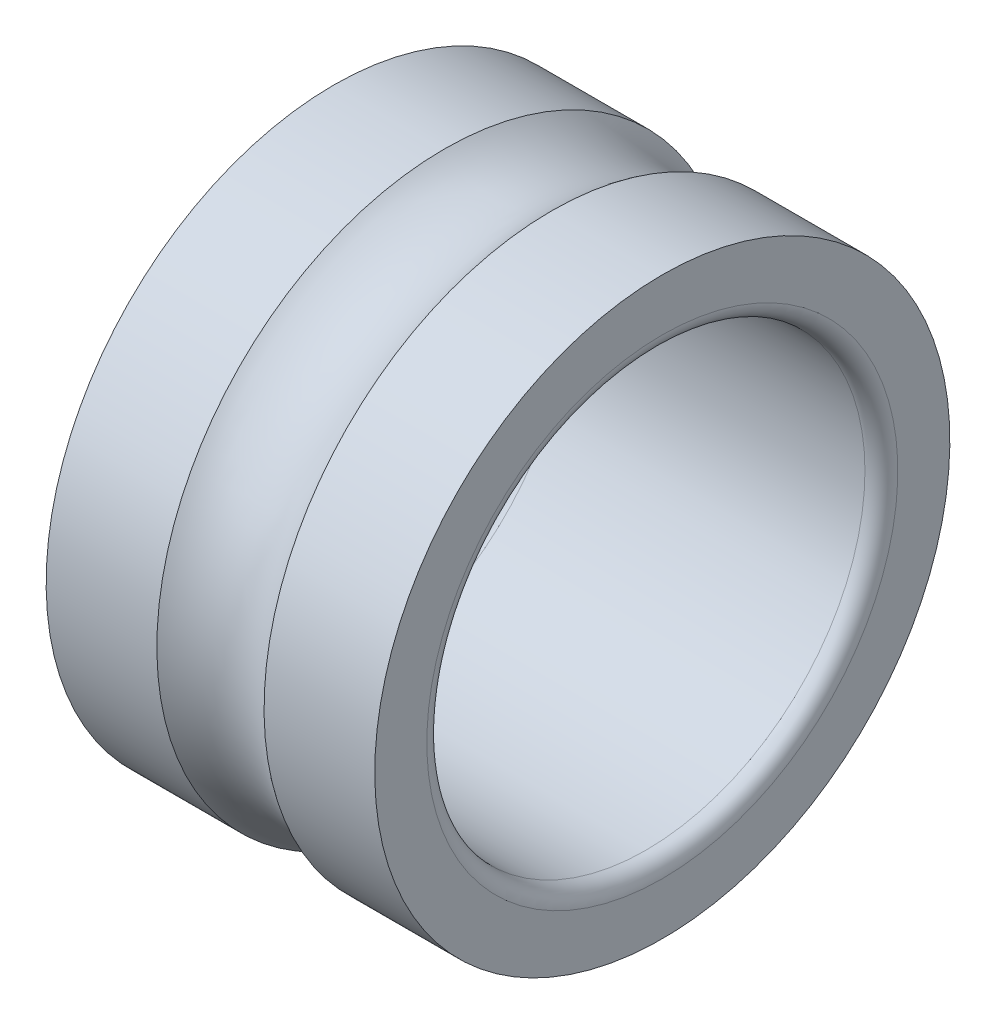
ISO-10303-21;
HEADER;
FILE_DESCRIPTION(('STEP AP214'),'2;1');
FILE_NAME('part.step','',(''),(''),'','','');
FILE_SCHEMA(('AUTOMOTIVE_DESIGN { 1 0 10303 214 1 1 1 1 }'));
ENDSEC;
DATA;
#1=APPLICATION_CONTEXT('core data for automotive mechanical design processes');
#2=APPLICATION_PROTOCOL_DEFINITION('international standard','automotive_design',2000,#1);
#3=PRODUCT_CONTEXT('',#1,'mechanical');
#4=PRODUCT('Part','Part','',(#3));
#5=PRODUCT_RELATED_PRODUCT_CATEGORY('part','',(#4));
#6=PRODUCT_DEFINITION_FORMATION('','',#4);
#7=PRODUCT_DEFINITION_CONTEXT('part definition',#1,'design');
#8=PRODUCT_DEFINITION('design','',#6,#7);
#9=PRODUCT_DEFINITION_SHAPE('','',#8);
#10=(LENGTH_UNIT() NAMED_UNIT(*) SI_UNIT(.MILLI.,.METRE.));
#11=(NAMED_UNIT(*) PLANE_ANGLE_UNIT() SI_UNIT($,.RADIAN.));
#12=(NAMED_UNIT(*) SI_UNIT($,.STERADIAN.) SOLID_ANGLE_UNIT());
#13=UNCERTAINTY_MEASURE_WITH_UNIT(LENGTH_MEASURE(1.E-05),#10,'distance_accuracy_value','');
#14=(GEOMETRIC_REPRESENTATION_CONTEXT(3) GLOBAL_UNCERTAINTY_ASSIGNED_CONTEXT((#13)) GLOBAL_UNIT_ASSIGNED_CONTEXT((#10,
#11,#12)) REPRESENTATION_CONTEXT('',''));
#15=CARTESIAN_POINT('',(0.,0.,0.));
#16=DIRECTION('',(0.,0.,1.));
#17=DIRECTION('',(1.,0.,0.));
#18=AXIS2_PLACEMENT_3D('',#15,#16,#17);
#19=CARTESIAN_POINT('',(4.98929956315125,0.,0.));
#20=DIRECTION('',(-1.,0.,0.));
#21=DIRECTION('',(0.,1.,0.));
#22=AXIS2_PLACEMENT_3D('',#19,#20,#21);
#23=CYLINDRICAL_SURFACE('',#22,5.25);
#24=CARTESIAN_POINT('',(3.97859912630249,0.,0.));
#25=DIRECTION('',(1.,0.,0.));
#26=DIRECTION('',(0.,1.,0.));
#27=AXIS2_PLACEMENT_3D('',#24,#25,#26);
#28=CIRCLE('',#27,5.25);
#29=CARTESIAN_POINT('',(3.97859912630249,5.25,0.));
#30=VERTEX_POINT('',#29);
#31=EDGE_CURVE('E11',#30,#30,#28,.T.);
#32=ORIENTED_EDGE('',*,*,#31,.T.);
#33=EDGE_LOOP('',(#32));
#34=FACE_BOUND('',#33,.T.);
#35=CARTESIAN_POINT('',(6.,0.,0.));
#36=DIRECTION('',(1.,0.,0.));
#37=DIRECTION('',(0.,1.,0.));
#38=AXIS2_PLACEMENT_3D('',#35,#36,#37);
#39=CIRCLE('',#38,5.25);
#40=CARTESIAN_POINT('',(6.,5.25,0.));
#41=VERTEX_POINT('',#40);
#42=EDGE_CURVE('E61',#41,#41,#39,.T.);
#43=ORIENTED_EDGE('',*,*,#42,.F.);
#44=EDGE_LOOP('',(#43));
#45=FACE_BOUND('',#44,.T.);
#46=ADVANCED_FACE('F16',(#34,#45),#23,.T.);
#47=CARTESIAN_POINT('',(3.,0.,0.));
#48=DIRECTION('',(1.,0.,0.));
#49=DIRECTION('',(0.,0.,-1.));
#50=AXIS2_PLACEMENT_3D('',#47,#48,#49);
#51=TOROIDAL_SURFACE('',#50,6.5,1.5875);
#52=CARTESIAN_POINT('',(2.02140087369751,0.,0.));
#53=DIRECTION('',(1.,0.,0.));
#54=DIRECTION('',(0.,1.,0.));
#55=AXIS2_PLACEMENT_3D('',#52,#53,#54);
#56=CIRCLE('',#55,5.25);
#57=CARTESIAN_POINT('',(2.02140087369751,5.25,0.));
#58=VERTEX_POINT('',#57);
#59=EDGE_CURVE('E20',#58,#58,#56,.T.);
#60=ORIENTED_EDGE('',*,*,#59,.T.);
#61=EDGE_LOOP('',(#60));
#62=FACE_BOUND('',#61,.T.);
#63=ORIENTED_EDGE('',*,*,#31,.F.);
#64=EDGE_LOOP('',(#63));
#65=FACE_BOUND('',#64,.T.);
#66=ADVANCED_FACE('F83',(#62,#65),#51,.F.);
#67=CARTESIAN_POINT('',(1.01070043684875,0.,0.));
#68=DIRECTION('',(-1.,0.,0.));
#69=DIRECTION('',(0.,1.,0.));
#70=AXIS2_PLACEMENT_3D('',#67,#68,#69);
#71=CYLINDRICAL_SURFACE('',#70,5.25);
#72=CARTESIAN_POINT('',(0.,0.,0.));
#73=DIRECTION('',(1.,0.,0.));
#74=DIRECTION('',(0.,1.,0.));
#75=AXIS2_PLACEMENT_3D('',#72,#73,#74);
#76=CIRCLE('',#75,5.25);
#77=CARTESIAN_POINT('',(0.,5.25,0.));
#78=VERTEX_POINT('',#77);
#79=EDGE_CURVE('E49',#78,#78,#76,.T.);
#80=ORIENTED_EDGE('',*,*,#79,.T.);
#81=EDGE_LOOP('',(#80));
#82=FACE_BOUND('',#81,.T.);
#83=ORIENTED_EDGE('',*,*,#59,.F.);
#84=EDGE_LOOP('',(#83));
#85=FACE_BOUND('',#84,.T.);
#86=ADVANCED_FACE('F50',(#82,#85),#71,.T.);
#87=CARTESIAN_POINT('',(0.,4.775,0.));
#88=DIRECTION('',(-1.,0.,0.));
#89=DIRECTION('',(0.,-1.,0.));
#90=AXIS2_PLACEMENT_3D('',#87,#88,#89);
#91=PLANE('',#90);
#92=CARTESIAN_POINT('',(0.,0.,0.));
#93=DIRECTION('',(1.,0.,0.));
#94=DIRECTION('',(0.,1.,0.));
#95=AXIS2_PLACEMENT_3D('',#92,#93,#94);
#96=CIRCLE('',#95,4.3);
#97=CARTESIAN_POINT('',(0.,4.3,0.));
#98=VERTEX_POINT('',#97);
#99=EDGE_CURVE('E53',#98,#98,#96,.T.);
#100=ORIENTED_EDGE('',*,*,#99,.T.);
#101=EDGE_LOOP('',(#100));
#102=FACE_BOUND('',#101,.T.);
#103=ORIENTED_EDGE('',*,*,#79,.F.);
#104=EDGE_LOOP('',(#103));
#105=FACE_BOUND('',#104,.T.);
#106=ADVANCED_FACE('F93',(#102,#105),#91,.T.);
#107=CARTESIAN_POINT('',(0.3,0.,0.));
#108=DIRECTION('',(1.,0.,0.));
#109=DIRECTION('',(0.,0.,-1.));
#110=AXIS2_PLACEMENT_3D('',#107,#108,#109);
#111=TOROIDAL_SURFACE('',#110,4.3,0.3);
#112=CARTESIAN_POINT('',(0.3,0.,0.));
#113=DIRECTION('',(1.,0.,0.));
#114=DIRECTION('',(0.,1.,0.));
#115=AXIS2_PLACEMENT_3D('',#112,#113,#114);
#116=CIRCLE('',#115,4.);
#117=CARTESIAN_POINT('',(0.3,4.,0.));
#118=VERTEX_POINT('',#117);
#119=EDGE_CURVE('E55',#118,#118,#116,.T.);
#120=ORIENTED_EDGE('',*,*,#119,.T.);
#121=EDGE_LOOP('',(#120));
#122=FACE_BOUND('',#121,.T.);
#123=ORIENTED_EDGE('',*,*,#99,.F.);
#124=EDGE_LOOP('',(#123));
#125=FACE_BOUND('',#124,.T.);
#126=ADVANCED_FACE('F18',(#122,#125),#111,.T.);
#127=CARTESIAN_POINT('',(3.,0.,0.));
#128=DIRECTION('',(-1.,0.,0.));
#129=DIRECTION('',(0.,1.,0.));
#130=AXIS2_PLACEMENT_3D('',#127,#128,#129);
#131=CYLINDRICAL_SURFACE('',#130,4.);
#132=CARTESIAN_POINT('',(5.7,0.,0.));
#133=DIRECTION('',(1.,0.,0.));
#134=DIRECTION('',(0.,1.,0.));
#135=AXIS2_PLACEMENT_3D('',#132,#133,#134);
#136=CIRCLE('',#135,4.);
#137=CARTESIAN_POINT('',(5.7,4.,0.));
#138=VERTEX_POINT('',#137);
#139=EDGE_CURVE('E60',#138,#138,#136,.T.);
#140=ORIENTED_EDGE('',*,*,#139,.T.);
#141=EDGE_LOOP('',(#140));
#142=FACE_BOUND('',#141,.T.);
#143=ORIENTED_EDGE('',*,*,#119,.F.);
#144=EDGE_LOOP('',(#143));
#145=FACE_BOUND('',#144,.T.);
#146=ADVANCED_FACE('F79',(#142,#145),#131,.F.);
#147=CARTESIAN_POINT('',(5.7,0.,0.));
#148=DIRECTION('',(1.,0.,0.));
#149=DIRECTION('',(0.,0.,-1.));
#150=AXIS2_PLACEMENT_3D('',#147,#148,#149);
#151=TOROIDAL_SURFACE('',#150,4.3,0.3);
#152=CARTESIAN_POINT('',(6.,0.,0.));
#153=DIRECTION('',(1.,0.,0.));
#154=DIRECTION('',(0.,1.,0.));
#155=AXIS2_PLACEMENT_3D('',#152,#153,#154);
#156=CIRCLE('',#155,4.3);
#157=CARTESIAN_POINT('',(6.,4.3,0.));
#158=VERTEX_POINT('',#157);
#159=EDGE_CURVE('E58',#158,#158,#156,.T.);
#160=ORIENTED_EDGE('',*,*,#159,.T.);
#161=EDGE_LOOP('',(#160));
#162=FACE_BOUND('',#161,.T.);
#163=ORIENTED_EDGE('',*,*,#139,.F.);
#164=EDGE_LOOP('',(#163));
#165=FACE_BOUND('',#164,.T.);
#166=ADVANCED_FACE('F70',(#162,#165),#151,.T.);
#167=CARTESIAN_POINT('',(6.,4.775,0.));
#168=DIRECTION('',(1.,0.,0.));
#169=DIRECTION('',(0.,1.,0.));
#170=AXIS2_PLACEMENT_3D('',#167,#168,#169);
#171=PLANE('',#170);
#172=ORIENTED_EDGE('',*,*,#42,.T.);
#173=EDGE_LOOP('',(#172));
#174=FACE_BOUND('',#173,.T.);
#175=ORIENTED_EDGE('',*,*,#159,.F.);
#176=EDGE_LOOP('',(#175));
#177=FACE_BOUND('',#176,.T.);
#178=ADVANCED_FACE('F73',(#174,#177),#171,.T.);
#179=CLOSED_SHELL('',(#46,#66,#86,#106,#126,#146,#166,#178));
#180=MANIFOLD_SOLID_BREP('B1',#179);
#181=ADVANCED_BREP_SHAPE_REPRESENTATION('',(#18,#180),#14);
#182=SHAPE_DEFINITION_REPRESENTATION(#9,#181);
ENDSEC;
END-ISO-10303-21;
